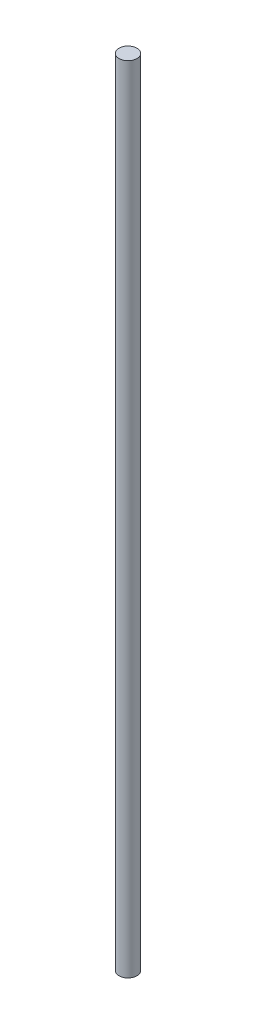
ISO-10303-21;
HEADER;
FILE_DESCRIPTION(('STEP AP214'),'2;1');
FILE_NAME('part.step','',(''),(''),'','','');
FILE_SCHEMA(('AUTOMOTIVE_DESIGN { 1 0 10303 214 1 1 1 1 }'));
ENDSEC;
DATA;
#1=APPLICATION_CONTEXT('core data for automotive mechanical design processes');
#2=APPLICATION_PROTOCOL_DEFINITION('international standard','automotive_design',2000,#1);
#3=PRODUCT_CONTEXT('',#1,'mechanical');
#4=PRODUCT('Part','Part','',(#3));
#5=PRODUCT_RELATED_PRODUCT_CATEGORY('part','',(#4));
#6=PRODUCT_DEFINITION_FORMATION('','',#4);
#7=PRODUCT_DEFINITION_CONTEXT('part definition',#1,'design');
#8=PRODUCT_DEFINITION('design','',#6,#7);
#9=PRODUCT_DEFINITION_SHAPE('','',#8);
#10=(LENGTH_UNIT() NAMED_UNIT(*) SI_UNIT(.MILLI.,.METRE.));
#11=(NAMED_UNIT(*) PLANE_ANGLE_UNIT() SI_UNIT($,.RADIAN.));
#12=(NAMED_UNIT(*) SI_UNIT($,.STERADIAN.) SOLID_ANGLE_UNIT());
#13=UNCERTAINTY_MEASURE_WITH_UNIT(LENGTH_MEASURE(1.E-05),#10,'distance_accuracy_value','');
#14=(GEOMETRIC_REPRESENTATION_CONTEXT(3) GLOBAL_UNCERTAINTY_ASSIGNED_CONTEXT((#13)) GLOBAL_UNIT_ASSIGNED_CONTEXT((#10,
#11,#12)) REPRESENTATION_CONTEXT('',''));
#15=CARTESIAN_POINT('',(0.,0.,0.));
#16=DIRECTION('',(0.,0.,1.));
#17=DIRECTION('',(1.,0.,0.));
#18=AXIS2_PLACEMENT_3D('',#15,#16,#17);
#19=CARTESIAN_POINT('',(0.,375.,0.));
#20=DIRECTION('',(0.,-1.,0.));
#21=DIRECTION('',(0.,0.,-1.));
#22=AXIS2_PLACEMENT_3D('',#19,#20,#21);
#23=CYLINDRICAL_SURFACE('',#22,4.25);
#24=CARTESIAN_POINT('',(0.,375.,0.));
#25=DIRECTION('',(0.,1.,0.));
#26=DIRECTION('',(0.,0.,1.));
#27=AXIS2_PLACEMENT_3D('',#24,#25,#26);
#28=CIRCLE('',#27,4.25);
#29=CARTESIAN_POINT('',(0.,375.,4.25));
#30=VERTEX_POINT('',#29);
#31=EDGE_CURVE('E10',#30,#30,#28,.T.);
#32=ORIENTED_EDGE('',*,*,#31,.F.);
#33=EDGE_LOOP('',(#32));
#34=FACE_BOUND('',#33,.T.);
#35=CARTESIAN_POINT('',(0.,0.,0.));
#36=DIRECTION('',(0.,1.,0.));
#37=DIRECTION('',(0.,0.,1.));
#38=AXIS2_PLACEMENT_3D('',#35,#36,#37);
#39=CIRCLE('',#38,4.25);
#40=CARTESIAN_POINT('',(0.,0.,4.25));
#41=VERTEX_POINT('',#40);
#42=EDGE_CURVE('E36',#41,#41,#39,.T.);
#43=ORIENTED_EDGE('',*,*,#42,.T.);
#44=EDGE_LOOP('',(#43));
#45=FACE_BOUND('',#44,.T.);
#46=ADVANCED_FACE('F33',(#34,#45),#23,.T.);
#47=CARTESIAN_POINT('',(0.,375.,0.));
#48=DIRECTION('',(0.,1.,0.));
#49=DIRECTION('',(0.,0.,1.));
#50=AXIS2_PLACEMENT_3D('',#47,#48,#49);
#51=PLANE('',#50);
#52=ORIENTED_EDGE('',*,*,#31,.T.);
#53=EDGE_LOOP('',(#52));
#54=FACE_BOUND('',#53,.T.);
#55=ADVANCED_FACE('F48',(#54),#51,.T.);
#56=CARTESIAN_POINT('',(0.,0.,0.));
#57=DIRECTION('',(0.,1.,0.));
#58=DIRECTION('',(0.,0.,1.));
#59=AXIS2_PLACEMENT_3D('',#56,#57,#58);
#60=PLANE('',#59);
#61=ORIENTED_EDGE('',*,*,#42,.F.);
#62=EDGE_LOOP('',(#61));
#63=FACE_BOUND('',#62,.T.);
#64=ADVANCED_FACE('F46',(#63),#60,.F.);
#65=CLOSED_SHELL('',(#46,#55,#64));
#66=MANIFOLD_SOLID_BREP('B2',#65);
#67=ADVANCED_BREP_SHAPE_REPRESENTATION('',(#18,#66),#14);
#68=SHAPE_DEFINITION_REPRESENTATION(#9,#67);
ENDSEC;
END-ISO-10303-21;
